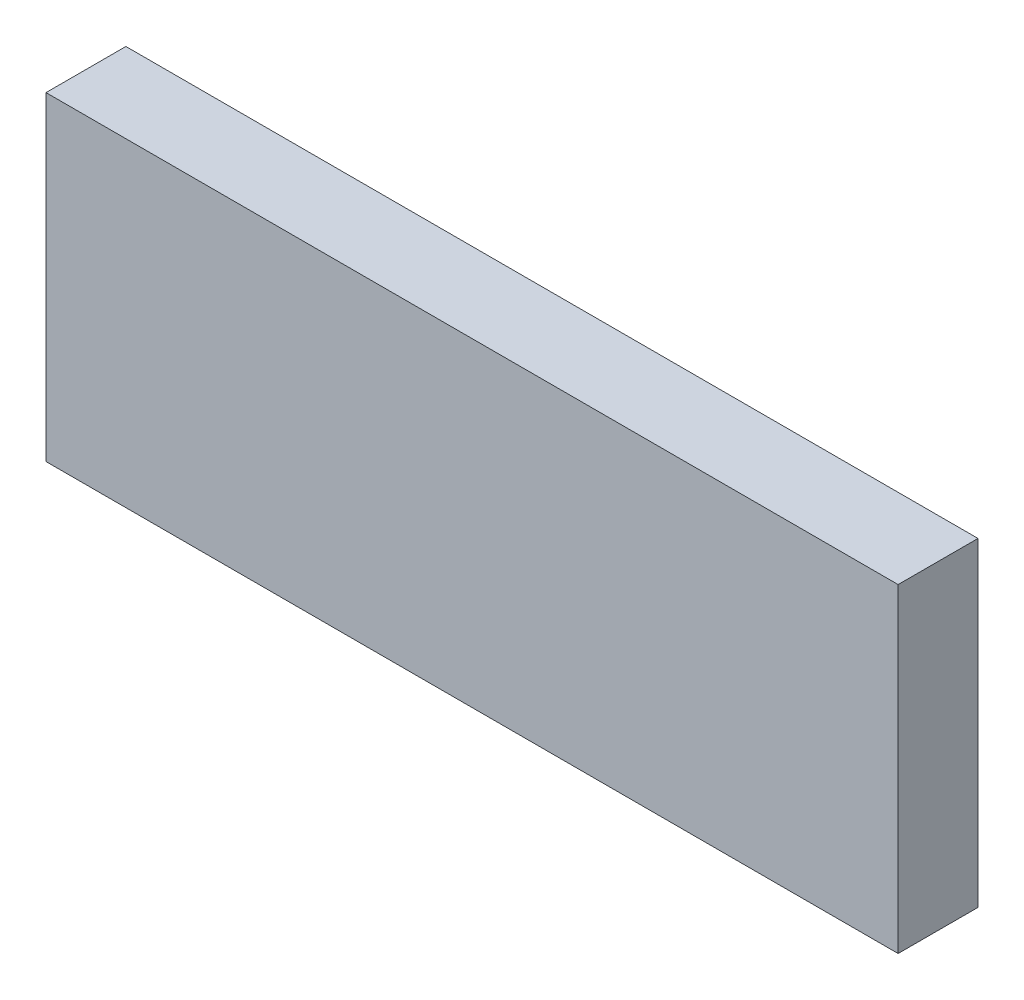
ISO-10303-21;
HEADER;
FILE_DESCRIPTION(('STEP AP214'),'2;1');
FILE_NAME('part.step','',(''),(''),'','','');
FILE_SCHEMA(('AUTOMOTIVE_DESIGN { 1 0 10303 214 1 1 1 1 }'));
ENDSEC;
DATA;
#1=APPLICATION_CONTEXT('core data for automotive mechanical design processes');
#2=APPLICATION_PROTOCOL_DEFINITION('international standard','automotive_design',2000,#1);
#3=PRODUCT_CONTEXT('',#1,'mechanical');
#4=PRODUCT('Part','Part','',(#3));
#5=PRODUCT_RELATED_PRODUCT_CATEGORY('part','',(#4));
#6=PRODUCT_DEFINITION_FORMATION('','',#4);
#7=PRODUCT_DEFINITION_CONTEXT('part definition',#1,'design');
#8=PRODUCT_DEFINITION('design','',#6,#7);
#9=PRODUCT_DEFINITION_SHAPE('','',#8);
#10=(LENGTH_UNIT() NAMED_UNIT(*) SI_UNIT(.MILLI.,.METRE.));
#11=(NAMED_UNIT(*) PLANE_ANGLE_UNIT() SI_UNIT($,.RADIAN.));
#12=(NAMED_UNIT(*) SI_UNIT($,.STERADIAN.) SOLID_ANGLE_UNIT());
#13=UNCERTAINTY_MEASURE_WITH_UNIT(LENGTH_MEASURE(1.E-05),#10,'distance_accuracy_value','');
#14=(GEOMETRIC_REPRESENTATION_CONTEXT(3) GLOBAL_UNCERTAINTY_ASSIGNED_CONTEXT((#13)) GLOBAL_UNIT_ASSIGNED_CONTEXT((#10,
#11,#12)) REPRESENTATION_CONTEXT('',''));
#15=CARTESIAN_POINT('',(0.,0.,0.));
#16=DIRECTION('',(0.,0.,1.));
#17=DIRECTION('',(1.,0.,0.));
#18=AXIS2_PLACEMENT_3D('',#15,#16,#17);
#19=CARTESIAN_POINT('',(0.,0.,19.05));
#20=DIRECTION('',(1.,0.,0.));
#21=DIRECTION('',(0.,0.,-1.));
#22=AXIS2_PLACEMENT_3D('',#19,#20,#21);
#23=PLANE('',#22);
#24=DIRECTION('',(0.,-1.,0.));
#25=VECTOR('',#24,1.);
#26=CARTESIAN_POINT('',(0.,0.,0.));
#27=LINE('',#26,#25);
#28=CARTESIAN_POINT('',(0.,76.2,0.));
#29=VERTEX_POINT('',#28);
#30=CARTESIAN_POINT('',(0.,0.,0.));
#31=VERTEX_POINT('',#30);
#32=EDGE_CURVE('E96',#29,#31,#27,.T.);
#33=ORIENTED_EDGE('',*,*,#32,.T.);
#34=DIRECTION('',(0.,0.,-1.));
#35=VECTOR('',#34,1.);
#36=CARTESIAN_POINT('',(0.,0.,19.05));
#37=LINE('',#36,#35);
#38=CARTESIAN_POINT('',(0.,0.,19.05));
#39=VERTEX_POINT('',#38);
#40=EDGE_CURVE('E11',#39,#31,#37,.T.);
#41=ORIENTED_EDGE('',*,*,#40,.F.);
#42=DIRECTION('',(0.,-1.,0.));
#43=VECTOR('',#42,1.);
#44=CARTESIAN_POINT('',(0.,0.,19.05));
#45=LINE('',#44,#43);
#46=CARTESIAN_POINT('',(0.,76.2,19.05));
#47=VERTEX_POINT('',#46);
#48=EDGE_CURVE('E84',#47,#39,#45,.T.);
#49=ORIENTED_EDGE('',*,*,#48,.F.);
#50=DIRECTION('',(0.,0.,-1.));
#51=VECTOR('',#50,1.);
#52=CARTESIAN_POINT('',(0.,76.2,19.05));
#53=LINE('',#52,#51);
#54=EDGE_CURVE('E92',#47,#29,#53,.T.);
#55=ORIENTED_EDGE('',*,*,#54,.T.);
#56=EDGE_LOOP('',(#33,#41,#49,#55));
#57=FACE_BOUND('',#56,.T.);
#58=ADVANCED_FACE('F33',(#57),#23,.F.);
#59=CARTESIAN_POINT('',(0.,0.,19.05));
#60=DIRECTION('',(0.,1.,0.));
#61=DIRECTION('',(0.,0.,1.));
#62=AXIS2_PLACEMENT_3D('',#59,#60,#61);
#63=PLANE('',#62);
#64=DIRECTION('',(1.,0.,0.));
#65=VECTOR('',#64,1.);
#66=CARTESIAN_POINT('',(0.,0.,0.));
#67=LINE('',#66,#65);
#68=CARTESIAN_POINT('',(203.2,0.,0.));
#69=VERTEX_POINT('',#68);
#70=EDGE_CURVE('E88',#31,#69,#67,.T.);
#71=ORIENTED_EDGE('',*,*,#70,.T.);
#72=DIRECTION('',(0.,0.,-1.));
#73=VECTOR('',#72,1.);
#74=CARTESIAN_POINT('',(203.2,0.,19.05));
#75=LINE('',#74,#73);
#76=CARTESIAN_POINT('',(203.2,0.,19.05));
#77=VERTEX_POINT('',#76);
#78=EDGE_CURVE('E41',#77,#69,#75,.T.);
#79=ORIENTED_EDGE('',*,*,#78,.F.);
#80=DIRECTION('',(1.,0.,0.));
#81=VECTOR('',#80,1.);
#82=CARTESIAN_POINT('',(0.,0.,19.05));
#83=LINE('',#82,#81);
#84=EDGE_CURVE('E79',#39,#77,#83,.T.);
#85=ORIENTED_EDGE('',*,*,#84,.F.);
#86=ORIENTED_EDGE('',*,*,#40,.T.);
#87=EDGE_LOOP('',(#71,#79,#85,#86));
#88=FACE_BOUND('',#87,.T.);
#89=ADVANCED_FACE('F87',(#88),#63,.F.);
#90=CARTESIAN_POINT('',(203.2,0.,19.05));
#91=DIRECTION('',(-1.,0.,0.));
#92=DIRECTION('',(0.,0.,1.));
#93=AXIS2_PLACEMENT_3D('',#90,#91,#92);
#94=PLANE('',#93);
#95=DIRECTION('',(0.,1.,0.));
#96=VECTOR('',#95,1.);
#97=CARTESIAN_POINT('',(203.2,0.,0.));
#98=LINE('',#97,#96);
#99=CARTESIAN_POINT('',(203.2,76.2,0.));
#100=VERTEX_POINT('',#99);
#101=EDGE_CURVE('E66',#69,#100,#98,.T.);
#102=ORIENTED_EDGE('',*,*,#101,.T.);
#103=DIRECTION('',(0.,0.,-1.));
#104=VECTOR('',#103,1.);
#105=CARTESIAN_POINT('',(203.2,76.2,19.05));
#106=LINE('',#105,#104);
#107=CARTESIAN_POINT('',(203.2,76.2,19.05));
#108=VERTEX_POINT('',#107);
#109=EDGE_CURVE('E89',#108,#100,#106,.T.);
#110=ORIENTED_EDGE('',*,*,#109,.F.);
#111=DIRECTION('',(0.,1.,0.));
#112=VECTOR('',#111,1.);
#113=CARTESIAN_POINT('',(203.2,0.,19.05));
#114=LINE('',#113,#112);
#115=EDGE_CURVE('E82',#77,#108,#114,.T.);
#116=ORIENTED_EDGE('',*,*,#115,.F.);
#117=ORIENTED_EDGE('',*,*,#78,.T.);
#118=EDGE_LOOP('',(#102,#110,#116,#117));
#119=FACE_BOUND('',#118,.T.);
#120=ADVANCED_FACE('F90',(#119),#94,.F.);
#121=CARTESIAN_POINT('',(0.,76.2,19.05));
#122=DIRECTION('',(0.,-1.,0.));
#123=DIRECTION('',(0.,0.,-1.));
#124=AXIS2_PLACEMENT_3D('',#121,#122,#123);
#125=PLANE('',#124);
#126=DIRECTION('',(-1.,0.,0.));
#127=VECTOR('',#126,1.);
#128=CARTESIAN_POINT('',(0.,76.2,0.));
#129=LINE('',#128,#127);
#130=EDGE_CURVE('E72',#100,#29,#129,.T.);
#131=ORIENTED_EDGE('',*,*,#130,.T.);
#132=ORIENTED_EDGE('',*,*,#54,.F.);
#133=DIRECTION('',(-1.,0.,0.));
#134=VECTOR('',#133,1.);
#135=CARTESIAN_POINT('',(0.,76.2,19.05));
#136=LINE('',#135,#134);
#137=EDGE_CURVE('E49',#108,#47,#136,.T.);
#138=ORIENTED_EDGE('',*,*,#137,.F.);
#139=ORIENTED_EDGE('',*,*,#109,.T.);
#140=EDGE_LOOP('',(#131,#132,#138,#139));
#141=FACE_BOUND('',#140,.T.);
#142=ADVANCED_FACE('F103',(#141),#125,.F.);
#143=CARTESIAN_POINT('',(0.,0.,19.05));
#144=DIRECTION('',(0.,0.,-1.));
#145=DIRECTION('',(-1.,0.,0.));
#146=AXIS2_PLACEMENT_3D('',#143,#144,#145);
#147=PLANE('',#146);
#148=ORIENTED_EDGE('',*,*,#48,.T.);
#149=ORIENTED_EDGE('',*,*,#84,.T.);
#150=ORIENTED_EDGE('',*,*,#115,.T.);
#151=ORIENTED_EDGE('',*,*,#137,.T.);
#152=EDGE_LOOP('',(#148,#149,#150,#151));
#153=FACE_BOUND('',#152,.T.);
#154=ADVANCED_FACE('F80',(#153),#147,.F.);
#155=CARTESIAN_POINT('',(0.,0.,0.));
#156=DIRECTION('',(0.,0.,-1.));
#157=DIRECTION('',(-1.,0.,0.));
#158=AXIS2_PLACEMENT_3D('',#155,#156,#157);
#159=PLANE('',#158);
#160=ORIENTED_EDGE('',*,*,#32,.F.);
#161=ORIENTED_EDGE('',*,*,#130,.F.);
#162=ORIENTED_EDGE('',*,*,#101,.F.);
#163=ORIENTED_EDGE('',*,*,#70,.F.);
#164=EDGE_LOOP('',(#160,#161,#162,#163));
#165=FACE_BOUND('',#164,.T.);
#166=ADVANCED_FACE('F106',(#165),#159,.T.);
#167=CLOSED_SHELL('',(#58,#89,#120,#142,#154,#166));
#168=MANIFOLD_SOLID_BREP('B2',#167);
#169=ADVANCED_BREP_SHAPE_REPRESENTATION('',(#18,#168),#14);
#170=SHAPE_DEFINITION_REPRESENTATION(#9,#169);
ENDSEC;
END-ISO-10303-21;
